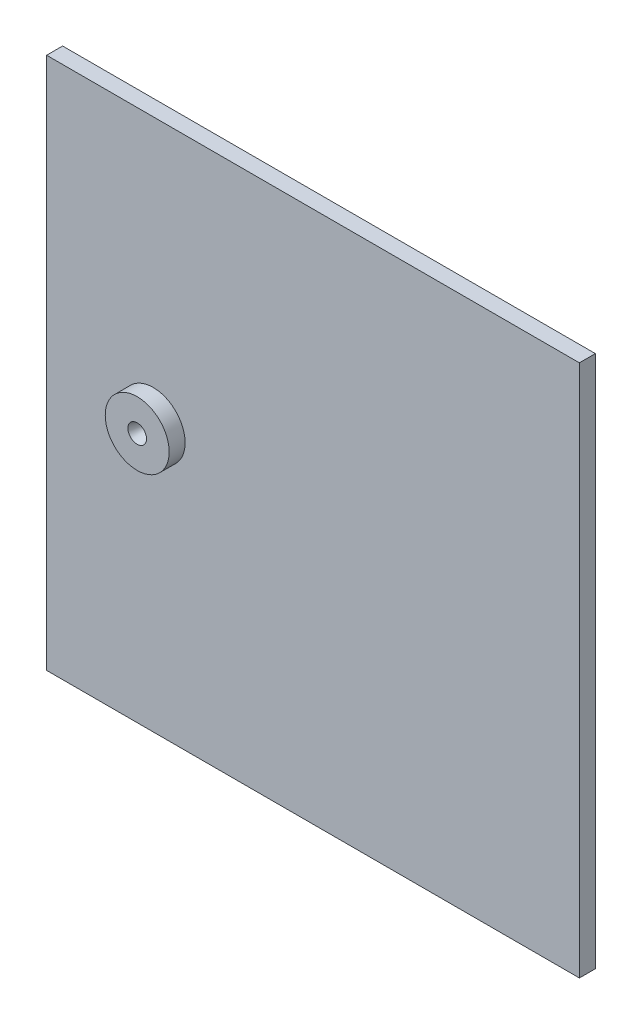
ISO-10303-21;
HEADER;
FILE_DESCRIPTION(('STEP AP214'),'2;1');
FILE_NAME('part.step','',(''),(''),'','','');
FILE_SCHEMA(('AUTOMOTIVE_DESIGN { 1 0 10303 214 1 1 1 1 }'));
ENDSEC;
DATA;
#1=APPLICATION_CONTEXT('core data for automotive mechanical design processes');
#2=APPLICATION_PROTOCOL_DEFINITION('international standard','automotive_design',2000,#1);
#3=PRODUCT_CONTEXT('',#1,'mechanical');
#4=PRODUCT('Part','Part','',(#3));
#5=PRODUCT_RELATED_PRODUCT_CATEGORY('part','',(#4));
#6=PRODUCT_DEFINITION_FORMATION('','',#4);
#7=PRODUCT_DEFINITION_CONTEXT('part definition',#1,'design');
#8=PRODUCT_DEFINITION('design','',#6,#7);
#9=PRODUCT_DEFINITION_SHAPE('','',#8);
#10=(LENGTH_UNIT() NAMED_UNIT(*) SI_UNIT(.MILLI.,.METRE.));
#11=(NAMED_UNIT(*) PLANE_ANGLE_UNIT() SI_UNIT($,.RADIAN.));
#12=(NAMED_UNIT(*) SI_UNIT($,.STERADIAN.) SOLID_ANGLE_UNIT());
#13=UNCERTAINTY_MEASURE_WITH_UNIT(LENGTH_MEASURE(1.E-05),#10,'distance_accuracy_value','');
#14=(GEOMETRIC_REPRESENTATION_CONTEXT(3) GLOBAL_UNCERTAINTY_ASSIGNED_CONTEXT((#13)) GLOBAL_UNIT_ASSIGNED_CONTEXT((#10,
#11,#12)) REPRESENTATION_CONTEXT('',''));
#15=CARTESIAN_POINT('',(0.,0.,0.));
#16=DIRECTION('',(0.,0.,1.));
#17=DIRECTION('',(1.,0.,0.));
#18=AXIS2_PLACEMENT_3D('',#15,#16,#17);
#19=CARTESIAN_POINT('',(0.,0.,3.));
#20=DIRECTION('',(0.,0.,-1.));
#21=DIRECTION('',(-1.,0.,0.));
#22=AXIS2_PLACEMENT_3D('',#19,#20,#21);
#23=PLANE('',#22);
#24=DIRECTION('',(0.,-1.,0.));
#25=VECTOR('',#24,1.);
#26=CARTESIAN_POINT('',(0.,0.,3.));
#27=LINE('',#26,#25);
#28=CARTESIAN_POINT('',(0.,100.,3.));
#29=VERTEX_POINT('',#28);
#30=CARTESIAN_POINT('',(0.,0.,3.));
#31=VERTEX_POINT('',#30);
#32=EDGE_CURVE('E86',#29,#31,#27,.T.);
#33=ORIENTED_EDGE('',*,*,#32,.T.);
#34=DIRECTION('',(1.,0.,0.));
#35=VECTOR('',#34,1.);
#36=CARTESIAN_POINT('',(0.,0.,3.));
#37=LINE('',#36,#35);
#38=CARTESIAN_POINT('',(100.,0.,3.));
#39=VERTEX_POINT('',#38);
#40=EDGE_CURVE('E81',#31,#39,#37,.T.);
#41=ORIENTED_EDGE('',*,*,#40,.T.);
#42=DIRECTION('',(0.,1.,0.));
#43=VECTOR('',#42,1.);
#44=CARTESIAN_POINT('',(100.,0.,3.));
#45=LINE('',#44,#43);
#46=CARTESIAN_POINT('',(100.,100.,3.));
#47=VERTEX_POINT('',#46);
#48=EDGE_CURVE('E84',#39,#47,#45,.T.);
#49=ORIENTED_EDGE('',*,*,#48,.T.);
#50=DIRECTION('',(-1.,0.,0.));
#51=VECTOR('',#50,1.);
#52=CARTESIAN_POINT('',(0.,100.,3.));
#53=LINE('',#52,#51);
#54=EDGE_CURVE('E50',#47,#29,#53,.T.);
#55=ORIENTED_EDGE('',*,*,#54,.T.);
#56=EDGE_LOOP('',(#33,#41,#49,#55));
#57=FACE_BOUND('',#56,.T.);
#58=CARTESIAN_POINT('',(20.,50.,3.));
#59=DIRECTION('',(0.,0.,-1.));
#60=DIRECTION('',(-1.,0.,0.));
#61=AXIS2_PLACEMENT_3D('',#58,#59,#60);
#62=CIRCLE('',#61,6.);
#63=CARTESIAN_POINT('',(14.,50.,3.));
#64=VERTEX_POINT('',#63);
#65=EDGE_CURVE('E114',#64,#64,#62,.F.);
#66=ORIENTED_EDGE('',*,*,#65,.F.);
#67=EDGE_LOOP('',(#66));
#68=FACE_BOUND('',#67,.T.);
#69=ADVANCED_FACE('F33',(#57,#68),#23,.F.);
#70=CARTESIAN_POINT('',(0.,0.,3.));
#71=DIRECTION('',(1.,0.,0.));
#72=DIRECTION('',(0.,0.,-1.));
#73=AXIS2_PLACEMENT_3D('',#70,#71,#72);
#74=PLANE('',#73);
#75=DIRECTION('',(0.,-1.,0.));
#76=VECTOR('',#75,1.);
#77=CARTESIAN_POINT('',(0.,0.,0.));
#78=LINE('',#77,#76);
#79=CARTESIAN_POINT('',(0.,100.,0.));
#80=VERTEX_POINT('',#79);
#81=CARTESIAN_POINT('',(0.,0.,0.));
#82=VERTEX_POINT('',#81);
#83=EDGE_CURVE('E101',#80,#82,#78,.T.);
#84=ORIENTED_EDGE('',*,*,#83,.T.);
#85=DIRECTION('',(0.,0.,-1.));
#86=VECTOR('',#85,1.);
#87=CARTESIAN_POINT('',(0.,0.,3.));
#88=LINE('',#87,#86);
#89=EDGE_CURVE('E92',#31,#82,#88,.T.);
#90=ORIENTED_EDGE('',*,*,#89,.F.);
#91=ORIENTED_EDGE('',*,*,#32,.F.);
#92=DIRECTION('',(0.,0.,-1.));
#93=VECTOR('',#92,1.);
#94=CARTESIAN_POINT('',(0.,100.,3.));
#95=LINE('',#94,#93);
#96=EDGE_CURVE('E97',#29,#80,#95,.T.);
#97=ORIENTED_EDGE('',*,*,#96,.T.);
#98=EDGE_LOOP('',(#84,#90,#91,#97));
#99=FACE_BOUND('',#98,.T.);
#100=ADVANCED_FACE('F147',(#99),#74,.F.);
#101=CARTESIAN_POINT('',(0.,0.,3.));
#102=DIRECTION('',(0.,1.,0.));
#103=DIRECTION('',(0.,0.,1.));
#104=AXIS2_PLACEMENT_3D('',#101,#102,#103);
#105=PLANE('',#104);
#106=DIRECTION('',(1.,0.,0.));
#107=VECTOR('',#106,1.);
#108=CARTESIAN_POINT('',(0.,0.,0.));
#109=LINE('',#108,#107);
#110=CARTESIAN_POINT('',(100.,0.,0.));
#111=VERTEX_POINT('',#110);
#112=EDGE_CURVE('E91',#82,#111,#109,.T.);
#113=ORIENTED_EDGE('',*,*,#112,.T.);
#114=DIRECTION('',(0.,0.,-1.));
#115=VECTOR('',#114,1.);
#116=CARTESIAN_POINT('',(100.,0.,3.));
#117=LINE('',#116,#115);
#118=EDGE_CURVE('E89',#39,#111,#117,.T.);
#119=ORIENTED_EDGE('',*,*,#118,.F.);
#120=ORIENTED_EDGE('',*,*,#40,.F.);
#121=ORIENTED_EDGE('',*,*,#89,.T.);
#122=EDGE_LOOP('',(#113,#119,#120,#121));
#123=FACE_BOUND('',#122,.T.);
#124=ADVANCED_FACE('F90',(#123),#105,.F.);
#125=CARTESIAN_POINT('',(100.,0.,3.));
#126=DIRECTION('',(-1.,0.,0.));
#127=DIRECTION('',(0.,0.,1.));
#128=AXIS2_PLACEMENT_3D('',#125,#126,#127);
#129=PLANE('',#128);
#130=DIRECTION('',(0.,1.,0.));
#131=VECTOR('',#130,1.);
#132=CARTESIAN_POINT('',(100.,0.,0.));
#133=LINE('',#132,#131);
#134=CARTESIAN_POINT('',(100.,100.,0.));
#135=VERTEX_POINT('',#134);
#136=EDGE_CURVE('E67',#111,#135,#133,.T.);
#137=ORIENTED_EDGE('',*,*,#136,.T.);
#138=DIRECTION('',(0.,0.,-1.));
#139=VECTOR('',#138,1.);
#140=CARTESIAN_POINT('',(100.,100.,3.));
#141=LINE('',#140,#139);
#142=EDGE_CURVE('E93',#47,#135,#141,.T.);
#143=ORIENTED_EDGE('',*,*,#142,.F.);
#144=ORIENTED_EDGE('',*,*,#48,.F.);
#145=ORIENTED_EDGE('',*,*,#118,.T.);
#146=EDGE_LOOP('',(#137,#143,#144,#145));
#147=FACE_BOUND('',#146,.T.);
#148=ADVANCED_FACE('F95',(#147),#129,.F.);
#149=CARTESIAN_POINT('',(0.,100.,3.));
#150=DIRECTION('',(0.,-1.,0.));
#151=DIRECTION('',(0.,0.,-1.));
#152=AXIS2_PLACEMENT_3D('',#149,#150,#151);
#153=PLANE('',#152);
#154=DIRECTION('',(-1.,0.,0.));
#155=VECTOR('',#154,1.);
#156=CARTESIAN_POINT('',(0.,100.,0.));
#157=LINE('',#156,#155);
#158=EDGE_CURVE('E73',#135,#80,#157,.T.);
#159=ORIENTED_EDGE('',*,*,#158,.T.);
#160=ORIENTED_EDGE('',*,*,#96,.F.);
#161=ORIENTED_EDGE('',*,*,#54,.F.);
#162=ORIENTED_EDGE('',*,*,#142,.T.);
#163=EDGE_LOOP('',(#159,#160,#161,#162));
#164=FACE_BOUND('',#163,.T.);
#165=ADVANCED_FACE('F163',(#164),#153,.F.);
#166=CARTESIAN_POINT('',(0.,0.,0.));
#167=DIRECTION('',(0.,0.,-1.));
#168=DIRECTION('',(-1.,0.,0.));
#169=AXIS2_PLACEMENT_3D('',#166,#167,#168);
#170=PLANE('',#169);
#171=CARTESIAN_POINT('',(20.,50.,0.));
#172=DIRECTION('',(0.,0.,-1.));
#173=DIRECTION('',(-1.,0.,0.));
#174=AXIS2_PLACEMENT_3D('',#171,#172,#173);
#175=CIRCLE('',#174,6.24999999999999);
#176=CARTESIAN_POINT('',(13.75,50.,0.));
#177=VERTEX_POINT('',#176);
#178=EDGE_CURVE('E111',#177,#177,#175,.T.);
#179=ORIENTED_EDGE('',*,*,#178,.F.);
#180=EDGE_LOOP('',(#179));
#181=FACE_BOUND('',#180,.T.);
#182=ORIENTED_EDGE('',*,*,#83,.F.);
#183=ORIENTED_EDGE('',*,*,#158,.F.);
#184=ORIENTED_EDGE('',*,*,#136,.F.);
#185=ORIENTED_EDGE('',*,*,#112,.F.);
#186=EDGE_LOOP('',(#182,#183,#184,#185));
#187=FACE_BOUND('',#186,.T.);
#188=ADVANCED_FACE('F160',(#181,#187),#170,.T.);
#189=CARTESIAN_POINT('',(20.,50.,-27.));
#190=DIRECTION('',(0.,0.,1.));
#191=DIRECTION('',(1.,0.,0.));
#192=AXIS2_PLACEMENT_3D('',#189,#190,#191);
#193=CYLINDRICAL_SURFACE('',#192,6.24999999999999);
#194=ORIENTED_EDGE('',*,*,#178,.T.);
#195=EDGE_LOOP('',(#194));
#196=FACE_BOUND('',#195,.T.);
#197=CARTESIAN_POINT('',(20.,50.,-27.));
#198=DIRECTION('',(0.,0.,1.));
#199=DIRECTION('',(1.,0.,0.));
#200=AXIS2_PLACEMENT_3D('',#197,#198,#199);
#201=CIRCLE('',#200,6.24999999999999);
#202=CARTESIAN_POINT('',(26.25,50.,-27.));
#203=VERTEX_POINT('',#202);
#204=EDGE_CURVE('E104',#203,#203,#201,.T.);
#205=ORIENTED_EDGE('',*,*,#204,.T.);
#206=EDGE_LOOP('',(#205));
#207=FACE_BOUND('',#206,.T.);
#208=ADVANCED_FACE('F158',(#196,#207),#193,.T.);
#209=CARTESIAN_POINT('',(20.,50.,-27.));
#210=DIRECTION('',(0.,0.,1.));
#211=DIRECTION('',(1.,0.,0.));
#212=AXIS2_PLACEMENT_3D('',#209,#210,#211);
#213=PLANE('',#212);
#214=CARTESIAN_POINT('',(20.,50.,-27.));
#215=DIRECTION('',(0.,0.,1.));
#216=DIRECTION('',(1.,0.,0.));
#217=AXIS2_PLACEMENT_3D('',#214,#215,#216);
#218=CIRCLE('',#217,1.74999999999999);
#219=CARTESIAN_POINT('',(21.75,50.,-27.));
#220=VERTEX_POINT('',#219);
#221=EDGE_CURVE('E42',#220,#220,#218,.T.);
#222=ORIENTED_EDGE('',*,*,#221,.T.);
#223=EDGE_LOOP('',(#222));
#224=FACE_BOUND('',#223,.T.);
#225=ORIENTED_EDGE('',*,*,#204,.F.);
#226=EDGE_LOOP('',(#225));
#227=FACE_BOUND('',#226,.T.);
#228=ADVANCED_FACE('F125',(#224,#227),#213,.F.);
#229=CARTESIAN_POINT('',(20.,50.,3.));
#230=DIRECTION('',(0.,0.,-1.));
#231=DIRECTION('',(-1.,0.,0.));
#232=AXIS2_PLACEMENT_3D('',#229,#230,#231);
#233=CYLINDRICAL_SURFACE('',#232,0.750000000000002);
#234=CARTESIAN_POINT('',(20.,50.,-24.));
#235=DIRECTION('',(0.,0.,1.));
#236=DIRECTION('',(1.,0.,0.));
#237=AXIS2_PLACEMENT_3D('',#234,#235,#236);
#238=CIRCLE('',#237,0.750000000000002);
#239=CARTESIAN_POINT('',(20.75,50.,-24.));
#240=VERTEX_POINT('',#239);
#241=EDGE_CURVE('E120',#240,#240,#238,.F.);
#242=ORIENTED_EDGE('',*,*,#241,.T.);
#243=EDGE_LOOP('',(#242));
#244=FACE_BOUND('',#243,.T.);
#245=CARTESIAN_POINT('',(20.,50.,2.99999999999994));
#246=DIRECTION('',(0.,0.,1.));
#247=DIRECTION('',(1.,0.,0.));
#248=AXIS2_PLACEMENT_3D('',#245,#246,#247);
#249=CIRCLE('',#248,0.750000000000002);
#250=CARTESIAN_POINT('',(20.75,50.,2.99999999999994));
#251=VERTEX_POINT('',#250);
#252=EDGE_CURVE('E117',#251,#251,#249,.T.);
#253=ORIENTED_EDGE('',*,*,#252,.T.);
#254=EDGE_LOOP('',(#253));
#255=FACE_BOUND('',#254,.T.);
#256=ADVANCED_FACE('F134',(#244,#255),#233,.F.);
#257=CARTESIAN_POINT('',(20.,50.,6.));
#258=DIRECTION('',(0.,0.,1.));
#259=DIRECTION('',(1.,0.,0.));
#260=AXIS2_PLACEMENT_3D('',#257,#258,#259);
#261=PLANE('',#260);
#262=CARTESIAN_POINT('',(20.,50.,6.));
#263=DIRECTION('',(0.,0.,1.));
#264=DIRECTION('',(1.,0.,0.));
#265=AXIS2_PLACEMENT_3D('',#262,#263,#264);
#266=CIRCLE('',#265,1.75000000000001);
#267=CARTESIAN_POINT('',(21.75,50.,6.));
#268=VERTEX_POINT('',#267);
#269=EDGE_CURVE('E11',#268,#268,#266,.F.);
#270=ORIENTED_EDGE('',*,*,#269,.T.);
#271=EDGE_LOOP('',(#270));
#272=FACE_BOUND('',#271,.T.);
#273=CARTESIAN_POINT('',(20.,50.,6.));
#274=DIRECTION('',(0.,0.,1.));
#275=DIRECTION('',(1.,0.,0.));
#276=AXIS2_PLACEMENT_3D('',#273,#274,#275);
#277=CIRCLE('',#276,6.);
#278=CARTESIAN_POINT('',(26.,50.,6.));
#279=VERTEX_POINT('',#278);
#280=EDGE_CURVE('E247',#279,#279,#277,.T.);
#281=ORIENTED_EDGE('',*,*,#280,.T.);
#282=EDGE_LOOP('',(#281));
#283=FACE_BOUND('',#282,.T.);
#284=ADVANCED_FACE('F137',(#272,#283),#261,.T.);
#285=CARTESIAN_POINT('',(20.,50.,6.));
#286=DIRECTION('',(0.,0.,-1.));
#287=DIRECTION('',(-1.,0.,0.));
#288=AXIS2_PLACEMENT_3D('',#285,#286,#287);
#289=CYLINDRICAL_SURFACE('',#288,6.);
#290=ORIENTED_EDGE('',*,*,#280,.F.);
#291=EDGE_LOOP('',(#290));
#292=FACE_BOUND('',#291,.T.);
#293=ORIENTED_EDGE('',*,*,#65,.T.);
#294=EDGE_LOOP('',(#293));
#295=FACE_BOUND('',#294,.T.);
#296=ADVANCED_FACE('F131',(#292,#295),#289,.T.);
#297=CARTESIAN_POINT('',(20.,50.,-24.));
#298=DIRECTION('',(0.,0.,-1.));
#299=DIRECTION('',(-1.,0.,0.));
#300=AXIS2_PLACEMENT_3D('',#297,#298,#299);
#301=CONICAL_SURFACE('',#300,0.750000000000002,0.321750554396639);
#302=ORIENTED_EDGE('',*,*,#221,.F.);
#303=EDGE_LOOP('',(#302));
#304=FACE_BOUND('',#303,.T.);
#305=ORIENTED_EDGE('',*,*,#241,.F.);
#306=EDGE_LOOP('',(#305));
#307=FACE_BOUND('',#306,.T.);
#308=ADVANCED_FACE('F128',(#304,#307),#301,.F.);
#309=CARTESIAN_POINT('',(20.,50.,2.99999999999994));
#310=DIRECTION('',(0.,0.,1.));
#311=DIRECTION('',(1.,0.,0.));
#312=AXIS2_PLACEMENT_3D('',#309,#310,#311);
#313=CONICAL_SURFACE('',#312,0.750000000000002,0.321750554396638);
#314=ORIENTED_EDGE('',*,*,#269,.F.);
#315=EDGE_LOOP('',(#314));
#316=FACE_BOUND('',#315,.T.);
#317=ORIENTED_EDGE('',*,*,#252,.F.);
#318=EDGE_LOOP('',(#317));
#319=FACE_BOUND('',#318,.T.);
#320=ADVANCED_FACE('F35',(#316,#319),#313,.F.);
#321=CLOSED_SHELL('',(#69,#100,#124,#148,#165,#188,#208,#228,#256,#284,#296,#308,#320));
#322=MANIFOLD_SOLID_BREP('B2',#321);
#323=ADVANCED_BREP_SHAPE_REPRESENTATION('',(#18,#322),#14);
#324=SHAPE_DEFINITION_REPRESENTATION(#9,#323);
ENDSEC;
END-ISO-10303-21;
